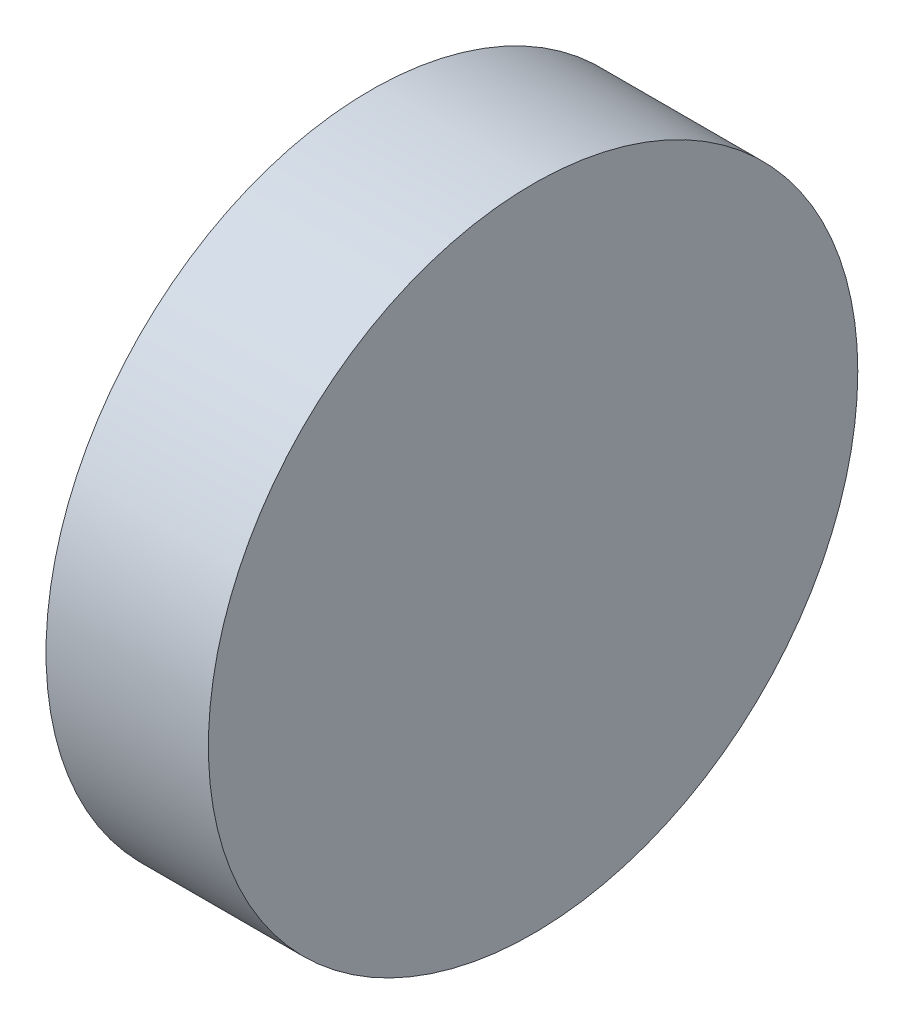
ISO-10303-21;
HEADER;
FILE_DESCRIPTION(('STEP AP214'),'2;1');
FILE_NAME('part.step','',(''),(''),'','','');
FILE_SCHEMA(('AUTOMOTIVE_DESIGN { 1 0 10303 214 1 1 1 1 }'));
ENDSEC;
DATA;
#1=APPLICATION_CONTEXT('core data for automotive mechanical design processes');
#2=APPLICATION_PROTOCOL_DEFINITION('international standard','automotive_design',2000,#1);
#3=PRODUCT_CONTEXT('',#1,'mechanical');
#4=PRODUCT('Part','Part','',(#3));
#5=PRODUCT_RELATED_PRODUCT_CATEGORY('part','',(#4));
#6=PRODUCT_DEFINITION_FORMATION('','',#4);
#7=PRODUCT_DEFINITION_CONTEXT('part definition',#1,'design');
#8=PRODUCT_DEFINITION('design','',#6,#7);
#9=PRODUCT_DEFINITION_SHAPE('','',#8);
#10=(LENGTH_UNIT() NAMED_UNIT(*) SI_UNIT(.MILLI.,.METRE.));
#11=(NAMED_UNIT(*) PLANE_ANGLE_UNIT() SI_UNIT($,.RADIAN.));
#12=(NAMED_UNIT(*) SI_UNIT($,.STERADIAN.) SOLID_ANGLE_UNIT());
#13=UNCERTAINTY_MEASURE_WITH_UNIT(LENGTH_MEASURE(1.E-05),#10,'distance_accuracy_value','');
#14=(GEOMETRIC_REPRESENTATION_CONTEXT(3) GLOBAL_UNCERTAINTY_ASSIGNED_CONTEXT((#13)) GLOBAL_UNIT_ASSIGNED_CONTEXT((#10,
#11,#12)) REPRESENTATION_CONTEXT('',''));
#15=CARTESIAN_POINT('',(0.,0.,0.));
#16=DIRECTION('',(0.,0.,1.));
#17=DIRECTION('',(1.,0.,0.));
#18=AXIS2_PLACEMENT_3D('',#15,#16,#17);
#19=CARTESIAN_POINT('',(10.,0.,0.));
#20=DIRECTION('',(-1.,0.,0.));
#21=DIRECTION('',(0.,0.,1.));
#22=AXIS2_PLACEMENT_3D('',#19,#20,#21);
#23=CYLINDRICAL_SURFACE('',#22,20.);
#24=CARTESIAN_POINT('',(10.,0.,0.));
#25=DIRECTION('',(1.,0.,0.));
#26=DIRECTION('',(0.,0.,-1.));
#27=AXIS2_PLACEMENT_3D('',#24,#25,#26);
#28=CIRCLE('',#27,20.);
#29=CARTESIAN_POINT('',(10.,0.,-20.));
#30=VERTEX_POINT('',#29);
#31=EDGE_CURVE('E11',#30,#30,#28,.T.);
#32=ORIENTED_EDGE('',*,*,#31,.F.);
#33=EDGE_LOOP('',(#32));
#34=FACE_BOUND('',#33,.T.);
#35=CARTESIAN_POINT('',(0.,0.,0.));
#36=DIRECTION('',(1.,0.,0.));
#37=DIRECTION('',(0.,0.,-1.));
#38=AXIS2_PLACEMENT_3D('',#35,#36,#37);
#39=CIRCLE('',#38,20.);
#40=CARTESIAN_POINT('',(0.,0.,-20.));
#41=VERTEX_POINT('',#40);
#42=EDGE_CURVE('E39',#41,#41,#39,.T.);
#43=ORIENTED_EDGE('',*,*,#42,.T.);
#44=EDGE_LOOP('',(#43));
#45=FACE_BOUND('',#44,.T.);
#46=ADVANCED_FACE('F36',(#34,#45),#23,.T.);
#47=CARTESIAN_POINT('',(10.,0.,0.));
#48=DIRECTION('',(1.,0.,0.));
#49=DIRECTION('',(0.,0.,-1.));
#50=AXIS2_PLACEMENT_3D('',#47,#48,#49);
#51=PLANE('',#50);
#52=ORIENTED_EDGE('',*,*,#31,.T.);
#53=EDGE_LOOP('',(#52));
#54=FACE_BOUND('',#53,.T.);
#55=ADVANCED_FACE('F69',(#54),#51,.T.);
#56=CARTESIAN_POINT('',(0.,0.,0.));
#57=DIRECTION('',(1.,0.,0.));
#58=DIRECTION('',(0.,0.,-1.));
#59=AXIS2_PLACEMENT_3D('',#56,#57,#58);
#60=PLANE('',#59);
#61=CARTESIAN_POINT('',(0.,-5.,0.));
#62=DIRECTION('',(-1.,0.,0.));
#63=DIRECTION('',(0.,0.,1.));
#64=AXIS2_PLACEMENT_3D('',#61,#62,#63);
#65=CIRCLE('',#64,1.025);
#66=CARTESIAN_POINT('',(0.,-5.,1.025));
#67=VERTEX_POINT('',#66);
#68=EDGE_CURVE('E59',#67,#67,#65,.T.);
#69=ORIENTED_EDGE('',*,*,#68,.F.);
#70=EDGE_LOOP('',(#69));
#71=FACE_BOUND('',#70,.T.);
#72=ORIENTED_EDGE('',*,*,#42,.F.);
#73=EDGE_LOOP('',(#72));
#74=FACE_BOUND('',#73,.T.);
#75=ADVANCED_FACE('F49',(#71,#74),#60,.F.);
#76=CARTESIAN_POINT('',(5.2,-5.,0.));
#77=DIRECTION('',(-1.,0.,0.));
#78=DIRECTION('',(0.,0.,1.));
#79=AXIS2_PLACEMENT_3D('',#76,#77,#78);
#80=CONICAL_SURFACE('',#79,0.799999999999988,1.02974425867664);
#81=CARTESIAN_POINT('',(5.68068849522205,-5.,0.));
#82=VERTEX_POINT('',#81);
#83=VERTEX_LOOP('',#82);
#84=FACE_BOUND('',#83,.T.);
#85=CARTESIAN_POINT('',(5.2,-5.,0.));
#86=DIRECTION('',(-1.,0.,0.));
#87=DIRECTION('',(0.,0.,1.));
#88=AXIS2_PLACEMENT_3D('',#85,#86,#87);
#89=CIRCLE('',#88,0.799999999999988);
#90=CARTESIAN_POINT('',(5.2,-5.,0.799999999999988));
#91=VERTEX_POINT('',#90);
#92=EDGE_CURVE('E53',#91,#91,#89,.T.);
#93=ORIENTED_EDGE('',*,*,#92,.T.);
#94=EDGE_LOOP('',(#93));
#95=FACE_BOUND('',#94,.T.);
#96=ADVANCED_FACE('F45',(#84,#95),#80,.F.);
#97=CARTESIAN_POINT('',(0.,-5.,0.));
#98=DIRECTION('',(-1.,0.,0.));
#99=DIRECTION('',(0.,0.,1.));
#100=AXIS2_PLACEMENT_3D('',#97,#98,#99);
#101=CYLINDRICAL_SURFACE('',#100,0.799999999999994);
#102=ORIENTED_EDGE('',*,*,#92,.F.);
#103=EDGE_LOOP('',(#102));
#104=FACE_BOUND('',#103,.T.);
#105=CARTESIAN_POINT('',(0.225,-5.,0.));
#106=DIRECTION('',(-1.,0.,0.));
#107=DIRECTION('',(0.,0.,1.));
#108=AXIS2_PLACEMENT_3D('',#105,#106,#107);
#109=CIRCLE('',#108,0.799999999999999);
#110=CARTESIAN_POINT('',(0.225,-5.,0.799999999999999));
#111=VERTEX_POINT('',#110);
#112=EDGE_CURVE('E55',#111,#111,#109,.T.);
#113=ORIENTED_EDGE('',*,*,#112,.T.);
#114=EDGE_LOOP('',(#113));
#115=FACE_BOUND('',#114,.T.);
#116=ADVANCED_FACE('F48',(#104,#115),#101,.F.);
#117=CARTESIAN_POINT('',(0.,-5.,0.));
#118=DIRECTION('',(-1.,0.,0.));
#119=DIRECTION('',(0.,0.,1.));
#120=AXIS2_PLACEMENT_3D('',#117,#118,#119);
#121=CONICAL_SURFACE('',#120,1.025,0.785398163397445);
#122=ORIENTED_EDGE('',*,*,#112,.F.);
#123=EDGE_LOOP('',(#122));
#124=FACE_BOUND('',#123,.T.);
#125=ORIENTED_EDGE('',*,*,#68,.T.);
#126=EDGE_LOOP('',(#125));
#127=FACE_BOUND('',#126,.T.);
#128=ADVANCED_FACE('F65',(#124,#127),#121,.F.);
#129=CLOSED_SHELL('',(#46,#55,#75,#96,#116,#128));
#130=MANIFOLD_SOLID_BREP('B2',#129);
#131=ADVANCED_BREP_SHAPE_REPRESENTATION('',(#18,#130),#14);
#132=SHAPE_DEFINITION_REPRESENTATION(#9,#131);
ENDSEC;
END-ISO-10303-21;
